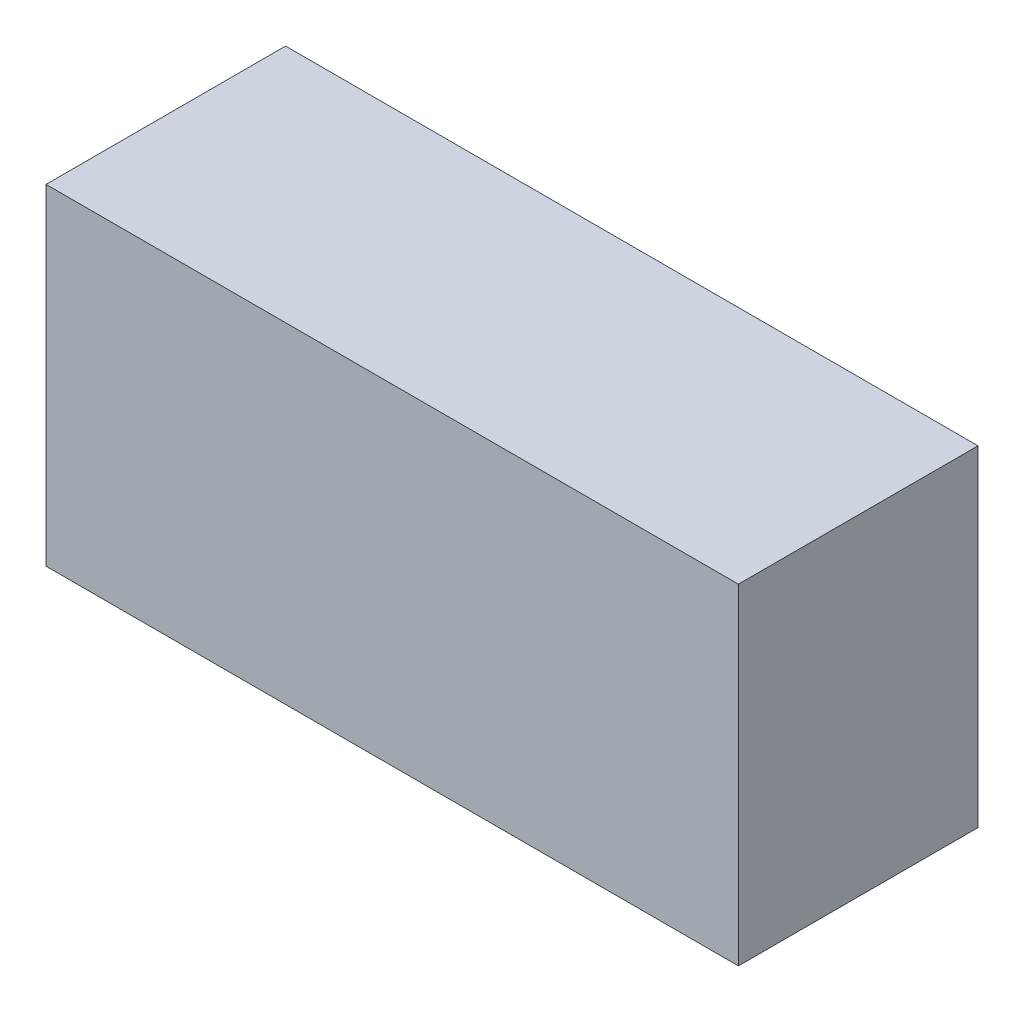
ISO-10303-21;
HEADER;
FILE_DESCRIPTION(('STEP AP214'),'2;1');
FILE_NAME('part.step','',(''),(''),'','','');
FILE_SCHEMA(('AUTOMOTIVE_DESIGN { 1 0 10303 214 1 1 1 1 }'));
ENDSEC;
DATA;
#1=APPLICATION_CONTEXT('core data for automotive mechanical design processes');
#2=APPLICATION_PROTOCOL_DEFINITION('international standard','automotive_design',2000,#1);
#3=PRODUCT_CONTEXT('',#1,'mechanical');
#4=PRODUCT('Part','Part','',(#3));
#5=PRODUCT_RELATED_PRODUCT_CATEGORY('part','',(#4));
#6=PRODUCT_DEFINITION_FORMATION('','',#4);
#7=PRODUCT_DEFINITION_CONTEXT('part definition',#1,'design');
#8=PRODUCT_DEFINITION('design','',#6,#7);
#9=PRODUCT_DEFINITION_SHAPE('','',#8);
#10=(LENGTH_UNIT() NAMED_UNIT(*) SI_UNIT(.MILLI.,.METRE.));
#11=(NAMED_UNIT(*) PLANE_ANGLE_UNIT() SI_UNIT($,.RADIAN.));
#12=(NAMED_UNIT(*) SI_UNIT($,.STERADIAN.) SOLID_ANGLE_UNIT());
#13=UNCERTAINTY_MEASURE_WITH_UNIT(LENGTH_MEASURE(1.E-05),#10,'distance_accuracy_value','');
#14=(GEOMETRIC_REPRESENTATION_CONTEXT(3) GLOBAL_UNCERTAINTY_ASSIGNED_CONTEXT((#13)) GLOBAL_UNIT_ASSIGNED_CONTEXT((#10,
#11,#12)) REPRESENTATION_CONTEXT('',''));
#15=CARTESIAN_POINT('',(0.,0.,0.));
#16=DIRECTION('',(0.,0.,1.));
#17=DIRECTION('',(1.,0.,0.));
#18=AXIS2_PLACEMENT_3D('',#15,#16,#17);
#19=CARTESIAN_POINT('',(-14.45001,6.89998,10.));
#20=DIRECTION('',(1.,0.,0.));
#21=DIRECTION('',(0.,0.,-1.));
#22=AXIS2_PLACEMENT_3D('',#19,#20,#21);
#23=PLANE('',#22);
#24=DIRECTION('',(0.,-1.,0.));
#25=VECTOR('',#24,1.);
#26=CARTESIAN_POINT('',(-14.45001,6.89998,0.));
#27=LINE('',#26,#25);
#28=CARTESIAN_POINT('',(-14.45001,6.89998,0.));
#29=VERTEX_POINT('',#28);
#30=CARTESIAN_POINT('',(-14.45001,-6.90003,0.));
#31=VERTEX_POINT('',#30);
#32=EDGE_CURVE('E101',#29,#31,#27,.T.);
#33=ORIENTED_EDGE('',*,*,#32,.T.);
#34=DIRECTION('',(0.,0.,-1.));
#35=VECTOR('',#34,1.);
#36=CARTESIAN_POINT('',(-14.45001,-6.90003,10.));
#37=LINE('',#36,#35);
#38=CARTESIAN_POINT('',(-14.45001,-6.90003,10.));
#39=VERTEX_POINT('',#38);
#40=EDGE_CURVE('E11',#39,#31,#37,.T.);
#41=ORIENTED_EDGE('',*,*,#40,.F.);
#42=DIRECTION('',(0.,-1.,0.));
#43=VECTOR('',#42,1.);
#44=CARTESIAN_POINT('',(-14.45001,6.89998,10.));
#45=LINE('',#44,#43);
#46=CARTESIAN_POINT('',(-14.45001,6.89998,10.));
#47=VERTEX_POINT('',#46);
#48=EDGE_CURVE('E89',#47,#39,#45,.T.);
#49=ORIENTED_EDGE('',*,*,#48,.F.);
#50=DIRECTION('',(0.,0.,-1.));
#51=VECTOR('',#50,1.);
#52=CARTESIAN_POINT('',(-14.45001,6.89998,10.));
#53=LINE('',#52,#51);
#54=EDGE_CURVE('E97',#47,#29,#53,.T.);
#55=ORIENTED_EDGE('',*,*,#54,.T.);
#56=EDGE_LOOP('',(#33,#41,#49,#55));
#57=FACE_BOUND('',#56,.T.);
#58=ADVANCED_FACE('F38',(#57),#23,.F.);
#59=CARTESIAN_POINT('',(-14.45001,-6.90003,10.));
#60=DIRECTION('',(0.,1.,0.));
#61=DIRECTION('',(0.,0.,1.));
#62=AXIS2_PLACEMENT_3D('',#59,#60,#61);
#63=PLANE('',#62);
#64=DIRECTION('',(1.,0.,0.));
#65=VECTOR('',#64,1.);
#66=CARTESIAN_POINT('',(-14.45001,-6.90003,0.));
#67=LINE('',#66,#65);
#68=CARTESIAN_POINT('',(14.45001,-6.90003,0.));
#69=VERTEX_POINT('',#68);
#70=EDGE_CURVE('E93',#31,#69,#67,.T.);
#71=ORIENTED_EDGE('',*,*,#70,.T.);
#72=DIRECTION('',(0.,0.,-1.));
#73=VECTOR('',#72,1.);
#74=CARTESIAN_POINT('',(14.45001,-6.90003,10.));
#75=LINE('',#74,#73);
#76=CARTESIAN_POINT('',(14.45001,-6.90003,10.));
#77=VERTEX_POINT('',#76);
#78=EDGE_CURVE('E46',#77,#69,#75,.T.);
#79=ORIENTED_EDGE('',*,*,#78,.F.);
#80=DIRECTION('',(1.,0.,0.));
#81=VECTOR('',#80,1.);
#82=CARTESIAN_POINT('',(-14.45001,-6.90003,10.));
#83=LINE('',#82,#81);
#84=EDGE_CURVE('E84',#39,#77,#83,.T.);
#85=ORIENTED_EDGE('',*,*,#84,.F.);
#86=ORIENTED_EDGE('',*,*,#40,.T.);
#87=EDGE_LOOP('',(#71,#79,#85,#86));
#88=FACE_BOUND('',#87,.T.);
#89=ADVANCED_FACE('F92',(#88),#63,.F.);
#90=CARTESIAN_POINT('',(14.45001,-6.90003,10.));
#91=DIRECTION('',(-1.,0.,0.));
#92=DIRECTION('',(0.,0.,1.));
#93=AXIS2_PLACEMENT_3D('',#90,#91,#92);
#94=PLANE('',#93);
#95=DIRECTION('',(0.,1.,0.));
#96=VECTOR('',#95,1.);
#97=CARTESIAN_POINT('',(14.45001,-6.90003,0.));
#98=LINE('',#97,#96);
#99=CARTESIAN_POINT('',(14.45001,6.89998,0.));
#100=VERTEX_POINT('',#99);
#101=EDGE_CURVE('E71',#69,#100,#98,.T.);
#102=ORIENTED_EDGE('',*,*,#101,.T.);
#103=DIRECTION('',(0.,0.,-1.));
#104=VECTOR('',#103,1.);
#105=CARTESIAN_POINT('',(14.45001,6.89998,10.));
#106=LINE('',#105,#104);
#107=CARTESIAN_POINT('',(14.45001,6.89998,10.));
#108=VERTEX_POINT('',#107);
#109=EDGE_CURVE('E94',#108,#100,#106,.T.);
#110=ORIENTED_EDGE('',*,*,#109,.F.);
#111=DIRECTION('',(0.,1.,0.));
#112=VECTOR('',#111,1.);
#113=CARTESIAN_POINT('',(14.45001,-6.90003,10.));
#114=LINE('',#113,#112);
#115=EDGE_CURVE('E87',#77,#108,#114,.T.);
#116=ORIENTED_EDGE('',*,*,#115,.F.);
#117=ORIENTED_EDGE('',*,*,#78,.T.);
#118=EDGE_LOOP('',(#102,#110,#116,#117));
#119=FACE_BOUND('',#118,.T.);
#120=ADVANCED_FACE('F95',(#119),#94,.F.);
#121=CARTESIAN_POINT('',(14.45001,6.89998,10.));
#122=DIRECTION('',(0.,-1.,0.));
#123=DIRECTION('',(0.,0.,-1.));
#124=AXIS2_PLACEMENT_3D('',#121,#122,#123);
#125=PLANE('',#124);
#126=DIRECTION('',(-1.,0.,0.));
#127=VECTOR('',#126,1.);
#128=CARTESIAN_POINT('',(14.45001,6.89998,0.));
#129=LINE('',#128,#127);
#130=EDGE_CURVE('E77',#100,#29,#129,.T.);
#131=ORIENTED_EDGE('',*,*,#130,.T.);
#132=ORIENTED_EDGE('',*,*,#54,.F.);
#133=DIRECTION('',(-1.,0.,0.));
#134=VECTOR('',#133,1.);
#135=CARTESIAN_POINT('',(14.45001,6.89998,10.));
#136=LINE('',#135,#134);
#137=EDGE_CURVE('E54',#108,#47,#136,.T.);
#138=ORIENTED_EDGE('',*,*,#137,.F.);
#139=ORIENTED_EDGE('',*,*,#109,.T.);
#140=EDGE_LOOP('',(#131,#132,#138,#139));
#141=FACE_BOUND('',#140,.T.);
#142=ADVANCED_FACE('F108',(#141),#125,.F.);
#143=CARTESIAN_POINT('',(0.,0.,10.));
#144=DIRECTION('',(0.,0.,1.));
#145=DIRECTION('',(1.,0.,0.));
#146=AXIS2_PLACEMENT_3D('',#143,#144,#145);
#147=PLANE('',#146);
#148=ORIENTED_EDGE('',*,*,#48,.T.);
#149=ORIENTED_EDGE('',*,*,#84,.T.);
#150=ORIENTED_EDGE('',*,*,#115,.T.);
#151=ORIENTED_EDGE('',*,*,#137,.T.);
#152=EDGE_LOOP('',(#148,#149,#150,#151));
#153=FACE_BOUND('',#152,.T.);
#154=ADVANCED_FACE('F85',(#153),#147,.T.);
#155=CARTESIAN_POINT('',(0.,0.,0.));
#156=DIRECTION('',(0.,0.,1.));
#157=DIRECTION('',(1.,0.,0.));
#158=AXIS2_PLACEMENT_3D('',#155,#156,#157);
#159=PLANE('',#158);
#160=ORIENTED_EDGE('',*,*,#32,.F.);
#161=ORIENTED_EDGE('',*,*,#130,.F.);
#162=ORIENTED_EDGE('',*,*,#101,.F.);
#163=ORIENTED_EDGE('',*,*,#70,.F.);
#164=EDGE_LOOP('',(#160,#161,#162,#163));
#165=FACE_BOUND('',#164,.T.);
#166=ADVANCED_FACE('F111',(#165),#159,.F.);
#167=CLOSED_SHELL('',(#58,#89,#120,#142,#154,#166));
#168=MANIFOLD_SOLID_BREP('B2',#167);
#169=ADVANCED_BREP_SHAPE_REPRESENTATION('',(#18,#168),#14);
#170=SHAPE_DEFINITION_REPRESENTATION(#9,#169);
ENDSEC;
END-ISO-10303-21;
